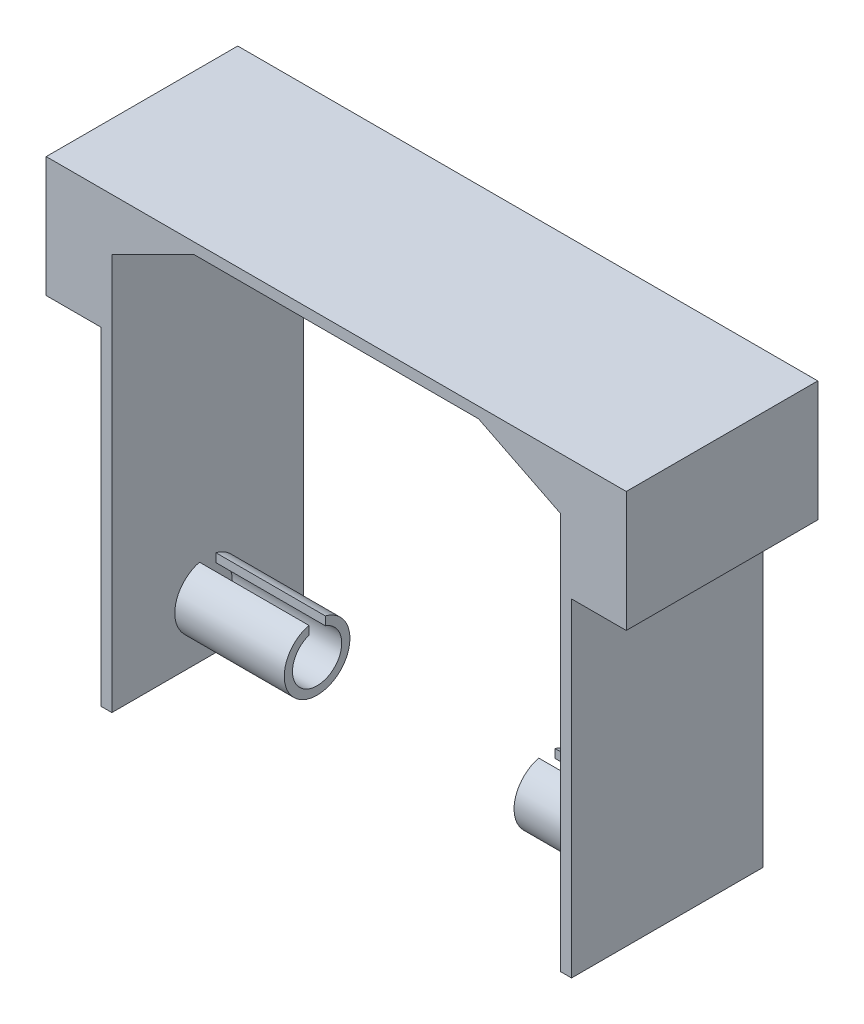
ISO-10303-21;
HEADER;
FILE_DESCRIPTION(('STEP AP214'),'2;1');
FILE_NAME('part.step','',(''),(''),'','','');
FILE_SCHEMA(('AUTOMOTIVE_DESIGN { 1 0 10303 214 1 1 1 1 }'));
ENDSEC;
DATA;
#1=APPLICATION_CONTEXT('core data for automotive mechanical design processes');
#2=APPLICATION_PROTOCOL_DEFINITION('international standard','automotive_design',2000,#1);
#3=PRODUCT_CONTEXT('',#1,'mechanical');
#4=PRODUCT('Part','Part','',(#3));
#5=PRODUCT_RELATED_PRODUCT_CATEGORY('part','',(#4));
#6=PRODUCT_DEFINITION_FORMATION('','',#4);
#7=PRODUCT_DEFINITION_CONTEXT('part definition',#1,'design');
#8=PRODUCT_DEFINITION('design','',#6,#7);
#9=PRODUCT_DEFINITION_SHAPE('','',#8);
#10=(LENGTH_UNIT() NAMED_UNIT(*) SI_UNIT(.MILLI.,.METRE.));
#11=(NAMED_UNIT(*) PLANE_ANGLE_UNIT() SI_UNIT($,.RADIAN.));
#12=(NAMED_UNIT(*) SI_UNIT($,.STERADIAN.) SOLID_ANGLE_UNIT());
#13=UNCERTAINTY_MEASURE_WITH_UNIT(LENGTH_MEASURE(1.E-05),#10,'distance_accuracy_value','');
#14=(GEOMETRIC_REPRESENTATION_CONTEXT(3) GLOBAL_UNCERTAINTY_ASSIGNED_CONTEXT((#13)) GLOBAL_UNIT_ASSIGNED_CONTEXT((#10,
#11,#12)) REPRESENTATION_CONTEXT('',''));
#15=CARTESIAN_POINT('',(0.,0.,0.));
#16=DIRECTION('',(0.,0.,1.));
#17=DIRECTION('',(1.,0.,0.));
#18=AXIS2_PLACEMENT_3D('',#15,#16,#17);
#19=CARTESIAN_POINT('',(0.,140.,0.));
#20=DIRECTION('',(0.,1.,0.));
#21=DIRECTION('',(0.,0.,1.));
#22=AXIS2_PLACEMENT_3D('',#19,#20,#21);
#23=PLANE('',#22);
#24=DIRECTION('',(-1.,0.,0.));
#25=VECTOR('',#24,1.);
#26=CARTESIAN_POINT('',(0.,140.,-25.));
#27=LINE('',#26,#25);
#28=CARTESIAN_POINT('',(30.,140.,-25.));
#29=VERTEX_POINT('',#28);
#30=CARTESIAN_POINT('',(0.,140.,-25.));
#31=VERTEX_POINT('',#30);
#32=EDGE_CURVE('E256',#29,#31,#27,.T.);
#33=ORIENTED_EDGE('',*,*,#32,.F.);
#34=DIRECTION('',(0.,0.,1.));
#35=VECTOR('',#34,1.);
#36=CARTESIAN_POINT('',(30.,140.,-35.));
#37=LINE('',#36,#35);
#38=CARTESIAN_POINT('',(30.,140.,-35.));
#39=VERTEX_POINT('',#38);
#40=EDGE_CURVE('E247',#39,#29,#37,.T.);
#41=ORIENTED_EDGE('',*,*,#40,.F.);
#42=DIRECTION('',(-1.,0.,0.));
#43=VECTOR('',#42,1.);
#44=CARTESIAN_POINT('',(0.,140.,-35.));
#45=LINE('',#44,#43);
#46=CARTESIAN_POINT('',(134.,140.,-35.));
#47=VERTEX_POINT('',#46);
#48=EDGE_CURVE('E254',#47,#39,#45,.T.);
#49=ORIENTED_EDGE('',*,*,#48,.F.);
#50=DIRECTION('',(0.,0.,1.));
#51=VECTOR('',#50,1.);
#52=CARTESIAN_POINT('',(134.,140.,-35.));
#53=LINE('',#52,#51);
#54=CARTESIAN_POINT('',(134.,140.,-25.));
#55=VERTEX_POINT('',#54);
#56=EDGE_CURVE('E308',#47,#55,#53,.T.);
#57=ORIENTED_EDGE('',*,*,#56,.T.);
#58=DIRECTION('',(-1.,0.,0.));
#59=VECTOR('',#58,1.);
#60=CARTESIAN_POINT('',(164.,140.,-25.));
#61=LINE('',#60,#59);
#62=CARTESIAN_POINT('',(164.,140.,-25.));
#63=VERTEX_POINT('',#62);
#64=EDGE_CURVE('E575',#63,#55,#61,.T.);
#65=ORIENTED_EDGE('',*,*,#64,.F.);
#66=DIRECTION('',(0.,0.,1.));
#67=VECTOR('',#66,1.);
#68=CARTESIAN_POINT('',(164.,140.,35.));
#69=LINE('',#68,#67);
#70=CARTESIAN_POINT('',(164.,140.,25.));
#71=VERTEX_POINT('',#70);
#72=EDGE_CURVE('E398',#63,#71,#69,.T.);
#73=ORIENTED_EDGE('',*,*,#72,.T.);
#74=DIRECTION('',(-1.,0.,0.));
#75=VECTOR('',#74,1.);
#76=CARTESIAN_POINT('',(164.,140.,25.));
#77=LINE('',#76,#75);
#78=CARTESIAN_POINT('',(134.,140.,25.));
#79=VERTEX_POINT('',#78);
#80=EDGE_CURVE('E336',#71,#79,#77,.T.);
#81=ORIENTED_EDGE('',*,*,#80,.T.);
#82=DIRECTION('',(0.,0.,-1.));
#83=VECTOR('',#82,1.);
#84=CARTESIAN_POINT('',(134.,140.,35.));
#85=LINE('',#84,#83);
#86=CARTESIAN_POINT('',(134.,140.,35.));
#87=VERTEX_POINT('',#86);
#88=EDGE_CURVE('E345',#87,#79,#85,.T.);
#89=ORIENTED_EDGE('',*,*,#88,.F.);
#90=DIRECTION('',(1.,0.,0.));
#91=VECTOR('',#90,1.);
#92=CARTESIAN_POINT('',(0.,140.,35.));
#93=LINE('',#92,#91);
#94=CARTESIAN_POINT('',(30.,140.,35.));
#95=VERTEX_POINT('',#94);
#96=EDGE_CURVE('E284',#95,#87,#93,.T.);
#97=ORIENTED_EDGE('',*,*,#96,.F.);
#98=DIRECTION('',(0.,0.,-1.));
#99=VECTOR('',#98,1.);
#100=CARTESIAN_POINT('',(30.,140.,35.));
#101=LINE('',#100,#99);
#102=CARTESIAN_POINT('',(30.,140.,25.));
#103=VERTEX_POINT('',#102);
#104=EDGE_CURVE('E73',#95,#103,#101,.T.);
#105=ORIENTED_EDGE('',*,*,#104,.T.);
#106=DIRECTION('',(-1.,0.,0.));
#107=VECTOR('',#106,1.);
#108=CARTESIAN_POINT('',(0.,140.,25.));
#109=LINE('',#108,#107);
#110=CARTESIAN_POINT('',(0.,140.,25.));
#111=VERTEX_POINT('',#110);
#112=EDGE_CURVE('E307',#103,#111,#109,.T.);
#113=ORIENTED_EDGE('',*,*,#112,.T.);
#114=DIRECTION('',(0.,0.,1.));
#115=VECTOR('',#114,1.);
#116=CARTESIAN_POINT('',(0.,140.,-35.));
#117=LINE('',#116,#115);
#118=EDGE_CURVE('E289',#31,#111,#117,.T.);
#119=ORIENTED_EDGE('',*,*,#118,.F.);
#120=EDGE_LOOP('',(#33,#41,#49,#57,#65,#73,#81,#89,#97,#105,#113,#119));
#121=FACE_BOUND('',#120,.T.);
#122=ADVANCED_FACE('F48',(#121),#23,.F.);
#123=CARTESIAN_POINT('',(0.,0.,0.));
#124=DIRECTION('',(-1.,0.,0.));
#125=DIRECTION('',(0.,0.,1.));
#126=AXIS2_PLACEMENT_3D('',#123,#124,#125);
#127=PLANE('',#126);
#128=CARTESIAN_POINT('',(0.,0.,0.));
#129=DIRECTION('',(1.,0.,0.));
#130=DIRECTION('',(0.,0.,-1.));
#131=AXIS2_PLACEMENT_3D('',#128,#129,#130);
#132=CIRCLE('',#131,12.);
#133=CARTESIAN_POINT('',(0.,11.6189500386223,3.));
#134=VERTEX_POINT('',#133);
#135=CARTESIAN_POINT('',(0.,11.6189500386223,-3.));
#136=VERTEX_POINT('',#135);
#137=EDGE_CURVE('E491',#134,#136,#132,.T.);
#138=ORIENTED_EDGE('',*,*,#137,.F.);
#139=DIRECTION('',(0.,1.,0.));
#140=VECTOR('',#139,1.);
#141=CARTESIAN_POINT('',(0.,11.6189500386223,3.));
#142=LINE('',#141,#140);
#143=CARTESIAN_POINT('',(0.,8.48528137423857,3.));
#144=VERTEX_POINT('',#143);
#145=EDGE_CURVE('E467',#144,#134,#142,.T.);
#146=ORIENTED_EDGE('',*,*,#145,.F.);
#147=CARTESIAN_POINT('',(0.,0.,0.));
#148=DIRECTION('',(-1.,0.,0.));
#149=DIRECTION('',(0.,0.,-1.));
#150=AXIS2_PLACEMENT_3D('',#147,#148,#149);
#151=CIRCLE('',#150,9.);
#152=CARTESIAN_POINT('',(0.,8.48528137423857,-3.));
#153=VERTEX_POINT('',#152);
#154=EDGE_CURVE('E479',#153,#144,#151,.T.);
#155=ORIENTED_EDGE('',*,*,#154,.F.);
#156=DIRECTION('',(0.,-1.,0.));
#157=VECTOR('',#156,1.);
#158=CARTESIAN_POINT('',(0.,11.6189500386223,-3.));
#159=LINE('',#158,#157);
#160=EDGE_CURVE('E486',#136,#153,#159,.T.);
#161=ORIENTED_EDGE('',*,*,#160,.F.);
#162=EDGE_LOOP('',(#138,#146,#155,#161));
#163=FACE_BOUND('',#162,.T.);
#164=DIRECTION('',(0.,-1.,0.));
#165=VECTOR('',#164,1.);
#166=CARTESIAN_POINT('',(0.,0.,-35.));
#167=LINE('',#166,#165);
#168=CARTESIAN_POINT('',(0.,125.,-35.));
#169=VERTEX_POINT('',#168);
#170=CARTESIAN_POINT('',(0.,-20.,-35.));
#171=VERTEX_POINT('',#170);
#172=EDGE_CURVE('E251',#169,#171,#167,.T.);
#173=ORIENTED_EDGE('',*,*,#172,.F.);
#174=DIRECTION('',(0.,0.,1.));
#175=VECTOR('',#174,1.);
#176=CARTESIAN_POINT('',(0.,125.,-35.));
#177=LINE('',#176,#175);
#178=CARTESIAN_POINT('',(0.,125.,-25.));
#179=VERTEX_POINT('',#178);
#180=EDGE_CURVE('E235',#169,#179,#177,.T.);
#181=ORIENTED_EDGE('',*,*,#180,.T.);
#182=DIRECTION('',(0.,-1.,0.));
#183=VECTOR('',#182,1.);
#184=CARTESIAN_POINT('',(0.,125.,-25.));
#185=LINE('',#184,#183);
#186=EDGE_CURVE('E587',#31,#179,#185,.T.);
#187=ORIENTED_EDGE('',*,*,#186,.F.);
#188=ORIENTED_EDGE('',*,*,#118,.T.);
#189=DIRECTION('',(0.,-1.,0.));
#190=VECTOR('',#189,1.);
#191=CARTESIAN_POINT('',(0.,140.,25.));
#192=LINE('',#191,#190);
#193=CARTESIAN_POINT('',(0.,125.,25.));
#194=VERTEX_POINT('',#193);
#195=EDGE_CURVE('E310',#111,#194,#192,.T.);
#196=ORIENTED_EDGE('',*,*,#195,.T.);
#197=DIRECTION('',(0.,0.,-1.));
#198=VECTOR('',#197,1.);
#199=CARTESIAN_POINT('',(0.,125.,35.));
#200=LINE('',#199,#198);
#201=CARTESIAN_POINT('',(0.,125.,35.));
#202=VERTEX_POINT('',#201);
#203=EDGE_CURVE('E323',#202,#194,#200,.T.);
#204=ORIENTED_EDGE('',*,*,#203,.F.);
#205=DIRECTION('',(0.,1.,0.));
#206=VECTOR('',#205,1.);
#207=CARTESIAN_POINT('',(0.,140.,35.));
#208=LINE('',#207,#206);
#209=CARTESIAN_POINT('',(0.,-20.,35.));
#210=VERTEX_POINT('',#209);
#211=EDGE_CURVE('E264',#210,#202,#208,.T.);
#212=ORIENTED_EDGE('',*,*,#211,.F.);
#213=DIRECTION('',(0.,0.,1.));
#214=VECTOR('',#213,1.);
#215=CARTESIAN_POINT('',(0.,-20.,-35.));
#216=LINE('',#215,#214);
#217=EDGE_CURVE('E261',#171,#210,#216,.T.);
#218=ORIENTED_EDGE('',*,*,#217,.F.);
#219=EDGE_LOOP('',(#173,#181,#187,#188,#196,#204,#212,#218));
#220=FACE_BOUND('',#219,.T.);
#221=ADVANCED_FACE('F259',(#163,#220),#127,.F.);
#222=CARTESIAN_POINT('',(164.,0.,0.));
#223=DIRECTION('',(1.,0.,0.));
#224=DIRECTION('',(0.,0.,-1.));
#225=AXIS2_PLACEMENT_3D('',#222,#223,#224);
#226=PLANE('',#225);
#227=DIRECTION('',(0.,-1.,0.));
#228=VECTOR('',#227,1.);
#229=CARTESIAN_POINT('',(164.,0.,-3.));
#230=LINE('',#229,#228);
#231=CARTESIAN_POINT('',(164.,11.6189500386223,-3.));
#232=VERTEX_POINT('',#231);
#233=CARTESIAN_POINT('',(164.,8.48528137423857,-3.));
#234=VERTEX_POINT('',#233);
#235=EDGE_CURVE('E367',#232,#234,#230,.T.);
#236=ORIENTED_EDGE('',*,*,#235,.T.);
#237=CARTESIAN_POINT('',(164.,0.,0.));
#238=DIRECTION('',(-1.,0.,0.));
#239=DIRECTION('',(0.,0.,1.));
#240=AXIS2_PLACEMENT_3D('',#237,#238,#239);
#241=CIRCLE('',#240,9.);
#242=CARTESIAN_POINT('',(164.,8.48528137423857,3.));
#243=VERTEX_POINT('',#242);
#244=EDGE_CURVE('E348',#234,#243,#241,.T.);
#245=ORIENTED_EDGE('',*,*,#244,.T.);
#246=DIRECTION('',(0.,-1.,0.));
#247=VECTOR('',#246,1.);
#248=CARTESIAN_POINT('',(164.,0.,3.));
#249=LINE('',#248,#247);
#250=CARTESIAN_POINT('',(164.,11.6189500386223,3.));
#251=VERTEX_POINT('',#250);
#252=EDGE_CURVE('E354',#251,#243,#249,.T.);
#253=ORIENTED_EDGE('',*,*,#252,.F.);
#254=CARTESIAN_POINT('',(164.,0.,0.));
#255=DIRECTION('',(-1.,0.,0.));
#256=DIRECTION('',(0.,0.,1.));
#257=AXIS2_PLACEMENT_3D('',#254,#255,#256);
#258=CIRCLE('',#257,12.);
#259=EDGE_CURVE('E370',#232,#251,#258,.T.);
#260=ORIENTED_EDGE('',*,*,#259,.F.);
#261=EDGE_LOOP('',(#236,#245,#253,#260));
#262=FACE_BOUND('',#261,.T.);
#263=DIRECTION('',(0.,1.,0.));
#264=VECTOR('',#263,1.);
#265=CARTESIAN_POINT('',(164.,125.,-25.));
#266=LINE('',#265,#264);
#267=CARTESIAN_POINT('',(164.,125.,-25.));
#268=VERTEX_POINT('',#267);
#269=EDGE_CURVE('E578',#268,#63,#266,.T.);
#270=ORIENTED_EDGE('',*,*,#269,.F.);
#271=DIRECTION('',(0.,0.,1.));
#272=VECTOR('',#271,1.);
#273=CARTESIAN_POINT('',(164.,125.,-35.));
#274=LINE('',#273,#272);
#275=CARTESIAN_POINT('',(164.,125.,-35.));
#276=VERTEX_POINT('',#275);
#277=EDGE_CURVE('E315',#276,#268,#274,.T.);
#278=ORIENTED_EDGE('',*,*,#277,.F.);
#279=DIRECTION('',(0.,1.,0.));
#280=VECTOR('',#279,1.);
#281=CARTESIAN_POINT('',(164.,140.,-35.));
#282=LINE('',#281,#280);
#283=CARTESIAN_POINT('',(164.,-20.,-35.));
#284=VERTEX_POINT('',#283);
#285=EDGE_CURVE('E395',#284,#276,#282,.T.);
#286=ORIENTED_EDGE('',*,*,#285,.F.);
#287=DIRECTION('',(0.,0.,-1.));
#288=VECTOR('',#287,1.);
#289=CARTESIAN_POINT('',(164.,-20.,35.));
#290=LINE('',#289,#288);
#291=CARTESIAN_POINT('',(164.,-20.,35.));
#292=VERTEX_POINT('',#291);
#293=EDGE_CURVE('E389',#292,#284,#290,.T.);
#294=ORIENTED_EDGE('',*,*,#293,.F.);
#295=DIRECTION('',(0.,-1.,0.));
#296=VECTOR('',#295,1.);
#297=CARTESIAN_POINT('',(164.,140.,35.));
#298=LINE('',#297,#296);
#299=CARTESIAN_POINT('',(164.,125.,35.));
#300=VERTEX_POINT('',#299);
#301=EDGE_CURVE('E384',#300,#292,#298,.T.);
#302=ORIENTED_EDGE('',*,*,#301,.F.);
#303=DIRECTION('',(0.,0.,-1.));
#304=VECTOR('',#303,1.);
#305=CARTESIAN_POINT('',(164.,125.,35.));
#306=LINE('',#305,#304);
#307=CARTESIAN_POINT('',(164.,125.,25.));
#308=VERTEX_POINT('',#307);
#309=EDGE_CURVE('E331',#300,#308,#306,.T.);
#310=ORIENTED_EDGE('',*,*,#309,.T.);
#311=DIRECTION('',(0.,1.,0.));
#312=VECTOR('',#311,1.);
#313=CARTESIAN_POINT('',(164.,140.,25.));
#314=LINE('',#313,#312);
#315=EDGE_CURVE('E326',#308,#71,#314,.T.);
#316=ORIENTED_EDGE('',*,*,#315,.T.);
#317=ORIENTED_EDGE('',*,*,#72,.F.);
#318=EDGE_LOOP('',(#270,#278,#286,#294,#302,#310,#316,#317));
#319=FACE_BOUND('',#318,.T.);
#320=ADVANCED_FACE('F617',(#262,#319),#226,.F.);
#321=CARTESIAN_POINT('',(40.,0.,0.));
#322=DIRECTION('',(-1.,0.,0.));
#323=DIRECTION('',(0.,0.,1.));
#324=AXIS2_PLACEMENT_3D('',#321,#322,#323);
#325=CYLINDRICAL_SURFACE('',#324,12.);
#326=ORIENTED_EDGE('',*,*,#137,.T.);
#327=DIRECTION('',(-1.,0.,0.));
#328=VECTOR('',#327,1.);
#329=CARTESIAN_POINT('',(40.,11.6189500386223,-3.));
#330=LINE('',#329,#328);
#331=CARTESIAN_POINT('',(40.,11.6189500386223,-3.));
#332=VERTEX_POINT('',#331);
#333=EDGE_CURVE('E12',#332,#136,#330,.T.);
#334=ORIENTED_EDGE('',*,*,#333,.F.);
#335=CARTESIAN_POINT('',(40.,0.,0.));
#336=DIRECTION('',(1.,0.,0.));
#337=DIRECTION('',(0.,0.,-1.));
#338=AXIS2_PLACEMENT_3D('',#335,#336,#337);
#339=CIRCLE('',#338,12.);
#340=CARTESIAN_POINT('',(40.,11.6189500386223,3.));
#341=VERTEX_POINT('',#340);
#342=EDGE_CURVE('E505',#341,#332,#339,.T.);
#343=ORIENTED_EDGE('',*,*,#342,.F.);
#344=DIRECTION('',(-1.,0.,0.));
#345=VECTOR('',#344,1.);
#346=CARTESIAN_POINT('',(40.,11.6189500386223,3.));
#347=LINE('',#346,#345);
#348=EDGE_CURVE('E459',#341,#134,#347,.T.);
#349=ORIENTED_EDGE('',*,*,#348,.T.);
#350=EDGE_LOOP('',(#326,#334,#343,#349));
#351=FACE_BOUND('',#350,.T.);
#352=ADVANCED_FACE('F50',(#351),#325,.T.);
#353=CARTESIAN_POINT('',(40.,11.6189500386223,-3.));
#354=DIRECTION('',(0.,0.,-1.));
#355=DIRECTION('',(-1.,0.,0.));
#356=AXIS2_PLACEMENT_3D('',#353,#354,#355);
#357=PLANE('',#356);
#358=ORIENTED_EDGE('',*,*,#160,.T.);
#359=DIRECTION('',(-1.,0.,0.));
#360=VECTOR('',#359,1.);
#361=CARTESIAN_POINT('',(40.,8.48528137423857,-3.));
#362=LINE('',#361,#360);
#363=CARTESIAN_POINT('',(40.,8.48528137423857,-3.));
#364=VERTEX_POINT('',#363);
#365=EDGE_CURVE('E58',#364,#153,#362,.T.);
#366=ORIENTED_EDGE('',*,*,#365,.F.);
#367=DIRECTION('',(0.,-1.,0.));
#368=VECTOR('',#367,1.);
#369=CARTESIAN_POINT('',(40.,11.6189500386223,-3.));
#370=LINE('',#369,#368);
#371=EDGE_CURVE('E484',#332,#364,#370,.T.);
#372=ORIENTED_EDGE('',*,*,#371,.F.);
#373=ORIENTED_EDGE('',*,*,#333,.T.);
#374=EDGE_LOOP('',(#358,#366,#372,#373));
#375=FACE_BOUND('',#374,.T.);
#376=ADVANCED_FACE('F483',(#375),#357,.F.);
#377=CARTESIAN_POINT('',(40.,0.,0.));
#378=DIRECTION('',(-1.,0.,0.));
#379=DIRECTION('',(0.,0.,1.));
#380=AXIS2_PLACEMENT_3D('',#377,#378,#379);
#381=CYLINDRICAL_SURFACE('',#380,9.);
#382=ORIENTED_EDGE('',*,*,#154,.T.);
#383=DIRECTION('',(-1.,0.,0.));
#384=VECTOR('',#383,1.);
#385=CARTESIAN_POINT('',(40.,8.48528137423857,3.));
#386=LINE('',#385,#384);
#387=CARTESIAN_POINT('',(40.,8.48528137423857,3.));
#388=VERTEX_POINT('',#387);
#389=EDGE_CURVE('E465',#388,#144,#386,.T.);
#390=ORIENTED_EDGE('',*,*,#389,.F.);
#391=CARTESIAN_POINT('',(40.,0.,0.));
#392=DIRECTION('',(-1.,0.,0.));
#393=DIRECTION('',(0.,0.,-1.));
#394=AXIS2_PLACEMENT_3D('',#391,#392,#393);
#395=CIRCLE('',#394,9.);
#396=EDGE_CURVE('E480',#364,#388,#395,.T.);
#397=ORIENTED_EDGE('',*,*,#396,.F.);
#398=ORIENTED_EDGE('',*,*,#365,.T.);
#399=EDGE_LOOP('',(#382,#390,#397,#398));
#400=FACE_BOUND('',#399,.T.);
#401=ADVANCED_FACE('F477',(#400),#381,.F.);
#402=CARTESIAN_POINT('',(40.,11.6189500386223,3.));
#403=DIRECTION('',(0.,0.,1.));
#404=DIRECTION('',(0.,-1.,0.));
#405=AXIS2_PLACEMENT_3D('',#402,#403,#404);
#406=PLANE('',#405);
#407=ORIENTED_EDGE('',*,*,#145,.T.);
#408=ORIENTED_EDGE('',*,*,#348,.F.);
#409=DIRECTION('',(0.,1.,0.));
#410=VECTOR('',#409,1.);
#411=CARTESIAN_POINT('',(40.,11.6189500386223,3.));
#412=LINE('',#411,#410);
#413=EDGE_CURVE('E466',#388,#341,#412,.T.);
#414=ORIENTED_EDGE('',*,*,#413,.F.);
#415=ORIENTED_EDGE('',*,*,#389,.T.);
#416=EDGE_LOOP('',(#407,#408,#414,#415));
#417=FACE_BOUND('',#416,.T.);
#418=ADVANCED_FACE('F686',(#417),#406,.F.);
#419=CARTESIAN_POINT('',(40.,0.,0.));
#420=DIRECTION('',(1.,0.,0.));
#421=DIRECTION('',(0.,0.,-1.));
#422=AXIS2_PLACEMENT_3D('',#419,#420,#421);
#423=PLANE('',#422);
#424=ORIENTED_EDGE('',*,*,#342,.T.);
#425=ORIENTED_EDGE('',*,*,#371,.T.);
#426=ORIENTED_EDGE('',*,*,#396,.T.);
#427=ORIENTED_EDGE('',*,*,#413,.T.);
#428=EDGE_LOOP('',(#424,#425,#426,#427));
#429=FACE_BOUND('',#428,.T.);
#430=ADVANCED_FACE('F682',(#429),#423,.T.);
#431=CARTESIAN_POINT('',(-4.,-20.,-35.));
#432=DIRECTION('',(0.,1.,0.));
#433=DIRECTION('',(0.,0.,1.));
#434=AXIS2_PLACEMENT_3D('',#431,#432,#433);
#435=PLANE('',#434);
#436=ORIENTED_EDGE('',*,*,#217,.T.);
#437=DIRECTION('',(1.,0.,0.));
#438=VECTOR('',#437,1.);
#439=CARTESIAN_POINT('',(-4.,-20.,35.));
#440=LINE('',#439,#438);
#441=CARTESIAN_POINT('',(-4.,-20.,35.));
#442=VERTEX_POINT('',#441);
#443=EDGE_CURVE('E495',#442,#210,#440,.T.);
#444=ORIENTED_EDGE('',*,*,#443,.F.);
#445=DIRECTION('',(0.,0.,1.));
#446=VECTOR('',#445,1.);
#447=CARTESIAN_POINT('',(-4.,-20.,-35.));
#448=LINE('',#447,#446);
#449=CARTESIAN_POINT('',(-4.,-20.,-35.));
#450=VERTEX_POINT('',#449);
#451=EDGE_CURVE('E263',#450,#442,#448,.T.);
#452=ORIENTED_EDGE('',*,*,#451,.F.);
#453=DIRECTION('',(1.,0.,0.));
#454=VECTOR('',#453,1.);
#455=CARTESIAN_POINT('',(-4.,-20.,-35.));
#456=LINE('',#455,#454);
#457=EDGE_CURVE('E277',#450,#171,#456,.T.);
#458=ORIENTED_EDGE('',*,*,#457,.T.);
#459=EDGE_LOOP('',(#436,#444,#452,#458));
#460=FACE_BOUND('',#459,.T.);
#461=ADVANCED_FACE('F679',(#460),#435,.F.);
#462=CARTESIAN_POINT('',(-4.,140.,35.));
#463=DIRECTION('',(0.,0.,-1.));
#464=DIRECTION('',(-1.,0.,0.));
#465=AXIS2_PLACEMENT_3D('',#462,#463,#464);
#466=PLANE('',#465);
#467=ORIENTED_EDGE('',*,*,#211,.T.);
#468=DIRECTION('',(0.894427190999916,0.447213595499958,0.));
#469=VECTOR('',#468,1.);
#470=CARTESIAN_POINT('',(0.,125.,35.));
#471=LINE('',#470,#469);
#472=EDGE_CURVE('E302',#202,#95,#471,.T.);
#473=ORIENTED_EDGE('',*,*,#472,.T.);
#474=ORIENTED_EDGE('',*,*,#96,.T.);
#475=DIRECTION('',(0.894427190999916,-0.447213595499958,0.));
#476=VECTOR('',#475,1.);
#477=CARTESIAN_POINT('',(134.,140.,35.));
#478=LINE('',#477,#476);
#479=EDGE_CURVE('E327',#87,#300,#478,.T.);
#480=ORIENTED_EDGE('',*,*,#479,.T.);
#481=ORIENTED_EDGE('',*,*,#301,.T.);
#482=DIRECTION('',(-1.,0.,0.));
#483=VECTOR('',#482,1.);
#484=CARTESIAN_POINT('',(168.,-20.,35.));
#485=LINE('',#484,#483);
#486=CARTESIAN_POINT('',(168.,-20.,35.));
#487=VERTEX_POINT('',#486);
#488=EDGE_CURVE('E406',#487,#292,#485,.T.);
#489=ORIENTED_EDGE('',*,*,#488,.F.);
#490=DIRECTION('',(0.,-1.,0.));
#491=VECTOR('',#490,1.);
#492=CARTESIAN_POINT('',(168.,140.,35.));
#493=LINE('',#492,#491);
#494=CARTESIAN_POINT('',(168.,100.,35.));
#495=VERTEX_POINT('',#494);
#496=EDGE_CURVE('E401',#495,#487,#493,.T.);
#497=ORIENTED_EDGE('',*,*,#496,.F.);
#498=DIRECTION('',(-1.,0.,0.));
#499=VECTOR('',#498,1.);
#500=CARTESIAN_POINT('',(188.,100.,35.));
#501=LINE('',#500,#499);
#502=CARTESIAN_POINT('',(188.,100.,35.));
#503=VERTEX_POINT('',#502);
#504=EDGE_CURVE('E390',#503,#495,#501,.T.);
#505=ORIENTED_EDGE('',*,*,#504,.F.);
#506=DIRECTION('',(0.,-1.,0.));
#507=VECTOR('',#506,1.);
#508=CARTESIAN_POINT('',(188.,144.,35.));
#509=LINE('',#508,#507);
#510=CARTESIAN_POINT('',(188.,144.,35.));
#511=VERTEX_POINT('',#510);
#512=EDGE_CURVE('E598',#511,#503,#509,.T.);
#513=ORIENTED_EDGE('',*,*,#512,.F.);
#514=DIRECTION('',(1.,0.,0.));
#515=VECTOR('',#514,1.);
#516=CARTESIAN_POINT('',(-24.,144.,35.));
#517=LINE('',#516,#515);
#518=CARTESIAN_POINT('',(-24.,144.,35.));
#519=VERTEX_POINT('',#518);
#520=EDGE_CURVE('E425',#519,#511,#517,.T.);
#521=ORIENTED_EDGE('',*,*,#520,.F.);
#522=DIRECTION('',(0.,1.,0.));
#523=VECTOR('',#522,1.);
#524=CARTESIAN_POINT('',(-24.,140.,35.));
#525=LINE('',#524,#523);
#526=CARTESIAN_POINT('',(-24.,100.,35.));
#527=VERTEX_POINT('',#526);
#528=EDGE_CURVE('E434',#527,#519,#525,.T.);
#529=ORIENTED_EDGE('',*,*,#528,.F.);
#530=DIRECTION('',(1.,0.,0.));
#531=VECTOR('',#530,1.);
#532=CARTESIAN_POINT('',(-24.,100.,35.));
#533=LINE('',#532,#531);
#534=CARTESIAN_POINT('',(-4.,100.,35.));
#535=VERTEX_POINT('',#534);
#536=EDGE_CURVE('E437',#527,#535,#533,.T.);
#537=ORIENTED_EDGE('',*,*,#536,.T.);
#538=DIRECTION('',(0.,1.,0.));
#539=VECTOR('',#538,1.);
#540=CARTESIAN_POINT('',(-4.,-20.,35.));
#541=LINE('',#540,#539);
#542=EDGE_CURVE('E269',#442,#535,#541,.T.);
#543=ORIENTED_EDGE('',*,*,#542,.F.);
#544=ORIENTED_EDGE('',*,*,#443,.T.);
#545=EDGE_LOOP('',(#467,#473,#474,#480,#481,#489,#497,#505,#513,#521,#529,#537,#543,#544));
#546=FACE_BOUND('',#545,.T.);
#547=ADVANCED_FACE('F608',(#546),#466,.F.);
#548=CARTESIAN_POINT('',(-4.,0.,-35.));
#549=DIRECTION('',(0.,0.,1.));
#550=DIRECTION('',(0.,-1.,0.));
#551=AXIS2_PLACEMENT_3D('',#548,#549,#550);
#552=PLANE('',#551);
#553=DIRECTION('',(0.894427190999916,0.447213595499958,0.));
#554=VECTOR('',#553,1.);
#555=CARTESIAN_POINT('',(30.,140.,-35.));
#556=LINE('',#555,#554);
#557=EDGE_CURVE('E238',#169,#39,#556,.T.);
#558=ORIENTED_EDGE('',*,*,#557,.F.);
#559=ORIENTED_EDGE('',*,*,#172,.T.);
#560=ORIENTED_EDGE('',*,*,#457,.F.);
#561=DIRECTION('',(0.,-1.,0.));
#562=VECTOR('',#561,1.);
#563=CARTESIAN_POINT('',(-4.,0.,-35.));
#564=LINE('',#563,#562);
#565=CARTESIAN_POINT('',(-4.,100.,-35.));
#566=VERTEX_POINT('',#565);
#567=EDGE_CURVE('E451',#566,#450,#564,.T.);
#568=ORIENTED_EDGE('',*,*,#567,.F.);
#569=DIRECTION('',(1.,0.,0.));
#570=VECTOR('',#569,1.);
#571=CARTESIAN_POINT('',(-24.,100.,-35.));
#572=LINE('',#571,#570);
#573=CARTESIAN_POINT('',(-24.,100.,-35.));
#574=VERTEX_POINT('',#573);
#575=EDGE_CURVE('E444',#574,#566,#572,.T.);
#576=ORIENTED_EDGE('',*,*,#575,.F.);
#577=DIRECTION('',(0.,-1.,0.));
#578=VECTOR('',#577,1.);
#579=CARTESIAN_POINT('',(-24.,140.,-35.));
#580=LINE('',#579,#578);
#581=CARTESIAN_POINT('',(-24.,144.,-35.));
#582=VERTEX_POINT('',#581);
#583=EDGE_CURVE('E427',#582,#574,#580,.T.);
#584=ORIENTED_EDGE('',*,*,#583,.F.);
#585=DIRECTION('',(-1.,0.,0.));
#586=VECTOR('',#585,1.);
#587=CARTESIAN_POINT('',(-24.,144.,-35.));
#588=LINE('',#587,#586);
#589=CARTESIAN_POINT('',(188.,144.,-35.));
#590=VERTEX_POINT('',#589);
#591=EDGE_CURVE('E419',#590,#582,#588,.T.);
#592=ORIENTED_EDGE('',*,*,#591,.F.);
#593=DIRECTION('',(0.,-1.,0.));
#594=VECTOR('',#593,1.);
#595=CARTESIAN_POINT('',(188.,144.,-35.));
#596=LINE('',#595,#594);
#597=CARTESIAN_POINT('',(188.,100.,-35.));
#598=VERTEX_POINT('',#597);
#599=EDGE_CURVE('E415',#590,#598,#596,.T.);
#600=ORIENTED_EDGE('',*,*,#599,.T.);
#601=DIRECTION('',(-1.,0.,0.));
#602=VECTOR('',#601,1.);
#603=CARTESIAN_POINT('',(188.,100.,-35.));
#604=LINE('',#603,#602);
#605=CARTESIAN_POINT('',(168.,100.,-35.));
#606=VERTEX_POINT('',#605);
#607=EDGE_CURVE('E529',#598,#606,#604,.T.);
#608=ORIENTED_EDGE('',*,*,#607,.T.);
#609=DIRECTION('',(0.,1.,0.));
#610=VECTOR('',#609,1.);
#611=CARTESIAN_POINT('',(168.,140.,-35.));
#612=LINE('',#611,#610);
#613=CARTESIAN_POINT('',(168.,-20.,-35.));
#614=VERTEX_POINT('',#613);
#615=EDGE_CURVE('E391',#614,#606,#612,.T.);
#616=ORIENTED_EDGE('',*,*,#615,.F.);
#617=DIRECTION('',(-1.,0.,0.));
#618=VECTOR('',#617,1.);
#619=CARTESIAN_POINT('',(168.,-20.,-35.));
#620=LINE('',#619,#618);
#621=EDGE_CURVE('E402',#614,#284,#620,.T.);
#622=ORIENTED_EDGE('',*,*,#621,.T.);
#623=ORIENTED_EDGE('',*,*,#285,.T.);
#624=DIRECTION('',(0.894427190999916,-0.447213595499958,0.));
#625=VECTOR('',#624,1.);
#626=CARTESIAN_POINT('',(134.,140.,-35.));
#627=LINE('',#626,#625);
#628=EDGE_CURVE('E65',#47,#276,#627,.T.);
#629=ORIENTED_EDGE('',*,*,#628,.F.);
#630=ORIENTED_EDGE('',*,*,#48,.T.);
#631=EDGE_LOOP('',(#558,#559,#560,#568,#576,#584,#592,#600,#608,#616,#622,#623,#629,#630));
#632=FACE_BOUND('',#631,.T.);
#633=ADVANCED_FACE('F249',(#632),#552,.F.);
#634=CARTESIAN_POINT('',(-4.,0.,0.));
#635=DIRECTION('',(-1.,0.,0.));
#636=DIRECTION('',(0.,0.,1.));
#637=AXIS2_PLACEMENT_3D('',#634,#635,#636);
#638=PLANE('',#637);
#639=DIRECTION('',(0.,0.,1.));
#640=VECTOR('',#639,1.);
#641=CARTESIAN_POINT('',(-4.,100.,-35.));
#642=LINE('',#641,#640);
#643=EDGE_CURVE('E424',#566,#535,#642,.T.);
#644=ORIENTED_EDGE('',*,*,#643,.F.);
#645=ORIENTED_EDGE('',*,*,#567,.T.);
#646=ORIENTED_EDGE('',*,*,#451,.T.);
#647=ORIENTED_EDGE('',*,*,#542,.T.);
#648=EDGE_LOOP('',(#644,#645,#646,#647));
#649=FACE_BOUND('',#648,.T.);
#650=ADVANCED_FACE('F670',(#649),#638,.T.);
#651=CARTESIAN_POINT('',(-24.,100.,-35.));
#652=DIRECTION('',(0.,1.,0.));
#653=DIRECTION('',(0.,0.,1.));
#654=AXIS2_PLACEMENT_3D('',#651,#652,#653);
#655=PLANE('',#654);
#656=ORIENTED_EDGE('',*,*,#643,.T.);
#657=ORIENTED_EDGE('',*,*,#536,.F.);
#658=DIRECTION('',(0.,0.,1.));
#659=VECTOR('',#658,1.);
#660=CARTESIAN_POINT('',(-24.,100.,-35.));
#661=LINE('',#660,#659);
#662=EDGE_CURVE('E431',#574,#527,#661,.T.);
#663=ORIENTED_EDGE('',*,*,#662,.F.);
#664=ORIENTED_EDGE('',*,*,#575,.T.);
#665=EDGE_LOOP('',(#656,#657,#663,#664));
#666=FACE_BOUND('',#665,.T.);
#667=ADVANCED_FACE('F666',(#666),#655,.F.);
#668=CARTESIAN_POINT('',(-24.,0.,0.));
#669=DIRECTION('',(-1.,0.,0.));
#670=DIRECTION('',(0.,0.,1.));
#671=AXIS2_PLACEMENT_3D('',#668,#669,#670);
#672=PLANE('',#671);
#673=ORIENTED_EDGE('',*,*,#583,.T.);
#674=ORIENTED_EDGE('',*,*,#662,.T.);
#675=ORIENTED_EDGE('',*,*,#528,.T.);
#676=DIRECTION('',(0.,0.,1.));
#677=VECTOR('',#676,1.);
#678=CARTESIAN_POINT('',(-24.,144.,-35.));
#679=LINE('',#678,#677);
#680=EDGE_CURVE('E294',#582,#519,#679,.T.);
#681=ORIENTED_EDGE('',*,*,#680,.F.);
#682=EDGE_LOOP('',(#673,#674,#675,#681));
#683=FACE_BOUND('',#682,.T.);
#684=ADVANCED_FACE('F662',(#683),#672,.T.);
#685=CARTESIAN_POINT('',(0.,144.,0.));
#686=DIRECTION('',(0.,1.,0.));
#687=DIRECTION('',(0.,0.,1.));
#688=AXIS2_PLACEMENT_3D('',#685,#686,#687);
#689=PLANE('',#688);
#690=ORIENTED_EDGE('',*,*,#680,.T.);
#691=ORIENTED_EDGE('',*,*,#520,.T.);
#692=DIRECTION('',(0.,0.,-1.));
#693=VECTOR('',#692,1.);
#694=CARTESIAN_POINT('',(188.,144.,35.));
#695=LINE('',#694,#693);
#696=EDGE_CURVE('E410',#511,#590,#695,.T.);
#697=ORIENTED_EDGE('',*,*,#696,.T.);
#698=ORIENTED_EDGE('',*,*,#591,.T.);
#699=EDGE_LOOP('',(#690,#691,#697,#698));
#700=FACE_BOUND('',#699,.T.);
#701=ADVANCED_FACE('F659',(#700),#689,.T.);
#702=CARTESIAN_POINT('',(188.,144.,-25.));
#703=DIRECTION('',(-1.,0.,0.));
#704=DIRECTION('',(0.,0.,1.));
#705=AXIS2_PLACEMENT_3D('',#702,#703,#704);
#706=PLANE('',#705);
#707=ORIENTED_EDGE('',*,*,#512,.T.);
#708=DIRECTION('',(0.,0.,-1.));
#709=VECTOR('',#708,1.);
#710=CARTESIAN_POINT('',(188.,100.,35.));
#711=LINE('',#710,#709);
#712=EDGE_CURVE('E532',#503,#598,#711,.T.);
#713=ORIENTED_EDGE('',*,*,#712,.T.);
#714=ORIENTED_EDGE('',*,*,#599,.F.);
#715=ORIENTED_EDGE('',*,*,#696,.F.);
#716=EDGE_LOOP('',(#707,#713,#714,#715));
#717=FACE_BOUND('',#716,.T.);
#718=ADVANCED_FACE('F605',(#717),#706,.F.);
#719=CARTESIAN_POINT('',(168.,-20.,35.));
#720=DIRECTION('',(0.,1.,0.));
#721=DIRECTION('',(0.,0.,1.));
#722=AXIS2_PLACEMENT_3D('',#719,#720,#721);
#723=PLANE('',#722);
#724=ORIENTED_EDGE('',*,*,#293,.T.);
#725=ORIENTED_EDGE('',*,*,#621,.F.);
#726=DIRECTION('',(0.,0.,-1.));
#727=VECTOR('',#726,1.);
#728=CARTESIAN_POINT('',(168.,-20.,35.));
#729=LINE('',#728,#727);
#730=EDGE_CURVE('E510',#487,#614,#729,.T.);
#731=ORIENTED_EDGE('',*,*,#730,.F.);
#732=ORIENTED_EDGE('',*,*,#488,.T.);
#733=EDGE_LOOP('',(#724,#725,#731,#732));
#734=FACE_BOUND('',#733,.T.);
#735=ADVANCED_FACE('F611',(#734),#723,.F.);
#736=CARTESIAN_POINT('',(168.,0.,0.));
#737=DIRECTION('',(1.,0.,0.));
#738=DIRECTION('',(0.,0.,-1.));
#739=AXIS2_PLACEMENT_3D('',#736,#737,#738);
#740=PLANE('',#739);
#741=DIRECTION('',(0.,0.,-1.));
#742=VECTOR('',#741,1.);
#743=CARTESIAN_POINT('',(168.,100.,35.));
#744=LINE('',#743,#742);
#745=EDGE_CURVE('E521',#495,#606,#744,.T.);
#746=ORIENTED_EDGE('',*,*,#745,.F.);
#747=ORIENTED_EDGE('',*,*,#496,.T.);
#748=ORIENTED_EDGE('',*,*,#730,.T.);
#749=ORIENTED_EDGE('',*,*,#615,.T.);
#750=EDGE_LOOP('',(#746,#747,#748,#749));
#751=FACE_BOUND('',#750,.T.);
#752=ADVANCED_FACE('F520',(#751),#740,.T.);
#753=CARTESIAN_POINT('',(188.,100.,35.));
#754=DIRECTION('',(0.,1.,0.));
#755=DIRECTION('',(0.,0.,1.));
#756=AXIS2_PLACEMENT_3D('',#753,#754,#755);
#757=PLANE('',#756);
#758=ORIENTED_EDGE('',*,*,#745,.T.);
#759=ORIENTED_EDGE('',*,*,#607,.F.);
#760=ORIENTED_EDGE('',*,*,#712,.F.);
#761=ORIENTED_EDGE('',*,*,#504,.T.);
#762=EDGE_LOOP('',(#758,#759,#760,#761));
#763=FACE_BOUND('',#762,.T.);
#764=ADVANCED_FACE('F527',(#763),#757,.F.);
#765=CARTESIAN_POINT('',(124.,0.,0.));
#766=DIRECTION('',(1.,0.,0.));
#767=DIRECTION('',(0.,0.,-1.));
#768=AXIS2_PLACEMENT_3D('',#765,#766,#767);
#769=CYLINDRICAL_SURFACE('',#768,9.);
#770=ORIENTED_EDGE('',*,*,#244,.F.);
#771=DIRECTION('',(1.,0.,0.));
#772=VECTOR('',#771,1.);
#773=CARTESIAN_POINT('',(124.,8.48528137423857,-3.));
#774=LINE('',#773,#772);
#775=CARTESIAN_POINT('',(124.,8.48528137423857,-3.));
#776=VERTEX_POINT('',#775);
#777=EDGE_CURVE('E533',#776,#234,#774,.T.);
#778=ORIENTED_EDGE('',*,*,#777,.F.);
#779=CARTESIAN_POINT('',(124.,0.,0.));
#780=DIRECTION('',(-1.,0.,0.));
#781=DIRECTION('',(0.,0.,1.));
#782=AXIS2_PLACEMENT_3D('',#779,#780,#781);
#783=CIRCLE('',#782,9.);
#784=CARTESIAN_POINT('',(124.,8.48528137423857,3.));
#785=VERTEX_POINT('',#784);
#786=EDGE_CURVE('E349',#776,#785,#783,.T.);
#787=ORIENTED_EDGE('',*,*,#786,.T.);
#788=DIRECTION('',(1.,0.,0.));
#789=VECTOR('',#788,1.);
#790=CARTESIAN_POINT('',(124.,8.48528137423857,3.));
#791=LINE('',#790,#789);
#792=EDGE_CURVE('E364',#785,#243,#791,.T.);
#793=ORIENTED_EDGE('',*,*,#792,.T.);
#794=EDGE_LOOP('',(#770,#778,#787,#793));
#795=FACE_BOUND('',#794,.T.);
#796=ADVANCED_FACE('F558',(#795),#769,.F.);
#797=CARTESIAN_POINT('',(124.,0.,-3.));
#798=DIRECTION('',(0.,0.,1.));
#799=DIRECTION('',(0.,-1.,0.));
#800=AXIS2_PLACEMENT_3D('',#797,#798,#799);
#801=PLANE('',#800);
#802=ORIENTED_EDGE('',*,*,#235,.F.);
#803=DIRECTION('',(1.,0.,0.));
#804=VECTOR('',#803,1.);
#805=CARTESIAN_POINT('',(124.,11.6189500386223,-3.));
#806=LINE('',#805,#804);
#807=CARTESIAN_POINT('',(124.,11.6189500386223,-3.));
#808=VERTEX_POINT('',#807);
#809=EDGE_CURVE('E544',#808,#232,#806,.T.);
#810=ORIENTED_EDGE('',*,*,#809,.F.);
#811=DIRECTION('',(0.,-1.,0.));
#812=VECTOR('',#811,1.);
#813=CARTESIAN_POINT('',(124.,0.,-3.));
#814=LINE('',#813,#812);
#815=EDGE_CURVE('E353',#808,#776,#814,.T.);
#816=ORIENTED_EDGE('',*,*,#815,.T.);
#817=ORIENTED_EDGE('',*,*,#777,.T.);
#818=EDGE_LOOP('',(#802,#810,#816,#817));
#819=FACE_BOUND('',#818,.T.);
#820=ADVANCED_FACE('F766',(#819),#801,.T.);
#821=CARTESIAN_POINT('',(124.,0.,0.));
#822=DIRECTION('',(1.,0.,0.));
#823=DIRECTION('',(0.,0.,-1.));
#824=AXIS2_PLACEMENT_3D('',#821,#822,#823);
#825=CYLINDRICAL_SURFACE('',#824,12.);
#826=ORIENTED_EDGE('',*,*,#259,.T.);
#827=DIRECTION('',(1.,0.,0.));
#828=VECTOR('',#827,1.);
#829=CARTESIAN_POINT('',(124.,11.6189500386223,3.));
#830=LINE('',#829,#828);
#831=CARTESIAN_POINT('',(124.,11.6189500386223,3.));
#832=VERTEX_POINT('',#831);
#833=EDGE_CURVE('E549',#832,#251,#830,.T.);
#834=ORIENTED_EDGE('',*,*,#833,.F.);
#835=CARTESIAN_POINT('',(124.,0.,0.));
#836=DIRECTION('',(-1.,0.,0.));
#837=DIRECTION('',(0.,0.,1.));
#838=AXIS2_PLACEMENT_3D('',#835,#836,#837);
#839=CIRCLE('',#838,12.);
#840=EDGE_CURVE('E358',#808,#832,#839,.T.);
#841=ORIENTED_EDGE('',*,*,#840,.F.);
#842=ORIENTED_EDGE('',*,*,#809,.T.);
#843=EDGE_LOOP('',(#826,#834,#841,#842));
#844=FACE_BOUND('',#843,.T.);
#845=ADVANCED_FACE('F778',(#844),#825,.T.);
#846=CARTESIAN_POINT('',(124.,0.,3.));
#847=DIRECTION('',(0.,0.,1.));
#848=DIRECTION('',(1.,0.,0.));
#849=AXIS2_PLACEMENT_3D('',#846,#847,#848);
#850=PLANE('',#849);
#851=ORIENTED_EDGE('',*,*,#252,.T.);
#852=ORIENTED_EDGE('',*,*,#792,.F.);
#853=DIRECTION('',(0.,-1.,0.));
#854=VECTOR('',#853,1.);
#855=CARTESIAN_POINT('',(124.,0.,3.));
#856=LINE('',#855,#854);
#857=EDGE_CURVE('E361',#832,#785,#856,.T.);
#858=ORIENTED_EDGE('',*,*,#857,.F.);
#859=ORIENTED_EDGE('',*,*,#833,.T.);
#860=EDGE_LOOP('',(#851,#852,#858,#859));
#861=FACE_BOUND('',#860,.T.);
#862=ADVANCED_FACE('F562',(#861),#850,.F.);
#863=CARTESIAN_POINT('',(124.,0.,0.));
#864=DIRECTION('',(-1.,0.,0.));
#865=DIRECTION('',(0.,0.,1.));
#866=AXIS2_PLACEMENT_3D('',#863,#864,#865);
#867=PLANE('',#866);
#868=ORIENTED_EDGE('',*,*,#786,.F.);
#869=ORIENTED_EDGE('',*,*,#815,.F.);
#870=ORIENTED_EDGE('',*,*,#840,.T.);
#871=ORIENTED_EDGE('',*,*,#857,.T.);
#872=EDGE_LOOP('',(#868,#869,#870,#871));
#873=FACE_BOUND('',#872,.T.);
#874=ADVANCED_FACE('F795',(#873),#867,.T.);
#875=CARTESIAN_POINT('',(134.,140.,35.));
#876=DIRECTION('',(0.447213595499958,0.894427190999916,0.));
#877=DIRECTION('',(-0.894427190999916,0.447213595499958,0.));
#878=AXIS2_PLACEMENT_3D('',#875,#876,#877);
#879=PLANE('',#878);
#880=DIRECTION('',(0.894427190999916,-0.447213595499958,0.));
#881=VECTOR('',#880,1.);
#882=CARTESIAN_POINT('',(134.,140.,25.));
#883=LINE('',#882,#881);
#884=EDGE_CURVE('E332',#79,#308,#883,.T.);
#885=ORIENTED_EDGE('',*,*,#884,.T.);
#886=ORIENTED_EDGE('',*,*,#309,.F.);
#887=ORIENTED_EDGE('',*,*,#479,.F.);
#888=ORIENTED_EDGE('',*,*,#88,.T.);
#889=EDGE_LOOP('',(#885,#886,#887,#888));
#890=FACE_BOUND('',#889,.T.);
#891=ADVANCED_FACE('F636',(#890),#879,.F.);
#892=CARTESIAN_POINT('',(0.,0.,25.));
#893=DIRECTION('',(0.,0.,-1.));
#894=DIRECTION('',(-1.,0.,0.));
#895=AXIS2_PLACEMENT_3D('',#892,#893,#894);
#896=PLANE('',#895);
#897=ORIENTED_EDGE('',*,*,#315,.F.);
#898=ORIENTED_EDGE('',*,*,#884,.F.);
#899=ORIENTED_EDGE('',*,*,#80,.F.);
#900=EDGE_LOOP('',(#897,#898,#899));
#901=FACE_BOUND('',#900,.T.);
#902=ADVANCED_FACE('F631',(#901),#896,.T.);
#903=CARTESIAN_POINT('',(0.,125.,35.));
#904=DIRECTION('',(-0.447213595499958,0.894427190999916,0.));
#905=DIRECTION('',(-0.894427190999916,-0.447213595499958,0.));
#906=AXIS2_PLACEMENT_3D('',#903,#904,#905);
#907=PLANE('',#906);
#908=DIRECTION('',(0.894427190999916,0.447213595499958,0.));
#909=VECTOR('',#908,1.);
#910=CARTESIAN_POINT('',(0.,125.,25.));
#911=LINE('',#910,#909);
#912=EDGE_CURVE('E314',#194,#103,#911,.T.);
#913=ORIENTED_EDGE('',*,*,#912,.T.);
#914=ORIENTED_EDGE('',*,*,#104,.F.);
#915=ORIENTED_EDGE('',*,*,#472,.F.);
#916=ORIENTED_EDGE('',*,*,#203,.T.);
#917=EDGE_LOOP('',(#913,#914,#915,#916));
#918=FACE_BOUND('',#917,.T.);
#919=ADVANCED_FACE('F639',(#918),#907,.F.);
#920=CARTESIAN_POINT('',(0.,0.,25.));
#921=DIRECTION('',(0.,0.,1.));
#922=DIRECTION('',(1.,0.,0.));
#923=AXIS2_PLACEMENT_3D('',#920,#921,#922);
#924=PLANE('',#923);
#925=ORIENTED_EDGE('',*,*,#195,.F.);
#926=ORIENTED_EDGE('',*,*,#112,.F.);
#927=ORIENTED_EDGE('',*,*,#912,.F.);
#928=EDGE_LOOP('',(#925,#926,#927));
#929=FACE_BOUND('',#928,.T.);
#930=ADVANCED_FACE('F641',(#929),#924,.F.);
#931=CARTESIAN_POINT('',(134.,140.,-35.));
#932=DIRECTION('',(-0.447213595499958,-0.894427190999916,0.));
#933=DIRECTION('',(0.894427190999916,-0.447213595499958,0.));
#934=AXIS2_PLACEMENT_3D('',#931,#932,#933);
#935=PLANE('',#934);
#936=DIRECTION('',(0.894427190999916,-0.447213595499958,0.));
#937=VECTOR('',#936,1.);
#938=CARTESIAN_POINT('',(134.,140.,-25.));
#939=LINE('',#938,#937);
#940=EDGE_CURVE('E571',#55,#268,#939,.T.);
#941=ORIENTED_EDGE('',*,*,#940,.F.);
#942=ORIENTED_EDGE('',*,*,#56,.F.);
#943=ORIENTED_EDGE('',*,*,#628,.T.);
#944=ORIENTED_EDGE('',*,*,#277,.T.);
#945=EDGE_LOOP('',(#941,#942,#943,#944));
#946=FACE_BOUND('',#945,.T.);
#947=ADVANCED_FACE('F622',(#946),#935,.T.);
#948=CARTESIAN_POINT('',(0.,0.,-25.));
#949=DIRECTION('',(0.,0.,1.));
#950=DIRECTION('',(1.,0.,0.));
#951=AXIS2_PLACEMENT_3D('',#948,#949,#950);
#952=PLANE('',#951);
#953=ORIENTED_EDGE('',*,*,#269,.T.);
#954=ORIENTED_EDGE('',*,*,#64,.T.);
#955=ORIENTED_EDGE('',*,*,#940,.T.);
#956=EDGE_LOOP('',(#953,#954,#955));
#957=FACE_BOUND('',#956,.T.);
#958=ADVANCED_FACE('F624',(#957),#952,.T.);
#959=CARTESIAN_POINT('',(30.,140.,-35.));
#960=DIRECTION('',(0.447213595499958,-0.894427190999916,0.));
#961=DIRECTION('',(0.894427190999916,0.447213595499958,0.));
#962=AXIS2_PLACEMENT_3D('',#959,#960,#961);
#963=PLANE('',#962);
#964=DIRECTION('',(0.894427190999916,0.447213595499958,0.));
#965=VECTOR('',#964,1.);
#966=CARTESIAN_POINT('',(30.,140.,-25.));
#967=LINE('',#966,#965);
#968=EDGE_CURVE('E241',#179,#29,#967,.T.);
#969=ORIENTED_EDGE('',*,*,#968,.F.);
#970=ORIENTED_EDGE('',*,*,#180,.F.);
#971=ORIENTED_EDGE('',*,*,#557,.T.);
#972=ORIENTED_EDGE('',*,*,#40,.T.);
#973=EDGE_LOOP('',(#969,#970,#971,#972));
#974=FACE_BOUND('',#973,.T.);
#975=ADVANCED_FACE('F237',(#974),#963,.T.);
#976=CARTESIAN_POINT('',(0.,0.,-25.));
#977=DIRECTION('',(0.,0.,-1.));
#978=DIRECTION('',(-1.,0.,0.));
#979=AXIS2_PLACEMENT_3D('',#976,#977,#978);
#980=PLANE('',#979);
#981=ORIENTED_EDGE('',*,*,#186,.T.);
#982=ORIENTED_EDGE('',*,*,#968,.T.);
#983=ORIENTED_EDGE('',*,*,#32,.T.);
#984=EDGE_LOOP('',(#981,#982,#983));
#985=FACE_BOUND('',#984,.T.);
#986=ADVANCED_FACE('F591',(#985),#980,.F.);
#987=CLOSED_SHELL('',(#122,#221,#320,#352,#376,#401,#418,#430,#461,#547,#633,#650,#667,#684,
#701,#718,#735,#752,#764,#796,#820,#845,#862,#874,#891,#902,#919,#930,#947,#958,#975,#986));
#988=MANIFOLD_SOLID_BREP('B2',#987);
#989=ADVANCED_BREP_SHAPE_REPRESENTATION('',(#18,#988),#14);
#990=SHAPE_DEFINITION_REPRESENTATION(#9,#989);
ENDSEC;
END-ISO-10303-21;
